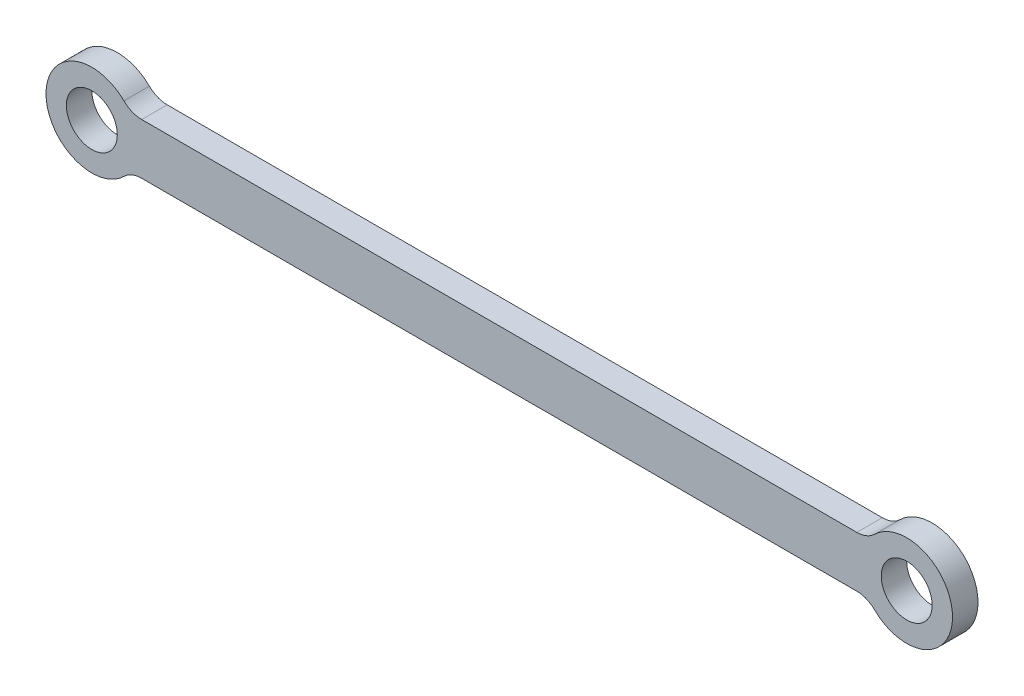
ISO-10303-21;
HEADER;
FILE_DESCRIPTION(('STEP AP214'),'2;1');
FILE_NAME('part.step','',(''),(''),'','','');
FILE_SCHEMA(('AUTOMOTIVE_DESIGN { 1 0 10303 214 1 1 1 1 }'));
ENDSEC;
DATA;
#1=APPLICATION_CONTEXT('core data for automotive mechanical design processes');
#2=APPLICATION_PROTOCOL_DEFINITION('international standard','automotive_design',2000,#1);
#3=PRODUCT_CONTEXT('',#1,'mechanical');
#4=PRODUCT('Part','Part','',(#3));
#5=PRODUCT_RELATED_PRODUCT_CATEGORY('part','',(#4));
#6=PRODUCT_DEFINITION_FORMATION('','',#4);
#7=PRODUCT_DEFINITION_CONTEXT('part definition',#1,'design');
#8=PRODUCT_DEFINITION('design','',#6,#7);
#9=PRODUCT_DEFINITION_SHAPE('','',#8);
#10=(LENGTH_UNIT() NAMED_UNIT(*) SI_UNIT(.MILLI.,.METRE.));
#11=(NAMED_UNIT(*) PLANE_ANGLE_UNIT() SI_UNIT($,.RADIAN.));
#12=(NAMED_UNIT(*) SI_UNIT($,.STERADIAN.) SOLID_ANGLE_UNIT());
#13=UNCERTAINTY_MEASURE_WITH_UNIT(LENGTH_MEASURE(1.E-05),#10,'distance_accuracy_value','');
#14=(GEOMETRIC_REPRESENTATION_CONTEXT(3) GLOBAL_UNCERTAINTY_ASSIGNED_CONTEXT((#13)) GLOBAL_UNIT_ASSIGNED_CONTEXT((#10,
#11,#12)) REPRESENTATION_CONTEXT('',''));
#15=CARTESIAN_POINT('',(0.,0.,0.));
#16=DIRECTION('',(0.,0.,1.));
#17=DIRECTION('',(1.,0.,0.));
#18=AXIS2_PLACEMENT_3D('',#15,#16,#17);
#19=CARTESIAN_POINT('',(150.202041028867,10.,5.));
#20=DIRECTION('',(0.,0.,1.));
#21=DIRECTION('',(1.,0.,0.));
#22=AXIS2_PLACEMENT_3D('',#19,#20,#21);
#23=PLANE('',#22);
#24=CARTESIAN_POINT('',(0.,0.,5.));
#25=DIRECTION('',(0.,0.,1.));
#26=DIRECTION('',(1.,0.,0.));
#27=AXIS2_PLACEMENT_3D('',#24,#25,#26);
#28=CIRCLE('',#27,5.);
#29=CARTESIAN_POINT('',(5.,0.,5.));
#30=VERTEX_POINT('',#29);
#31=EDGE_CURVE('E134',#30,#30,#28,.T.);
#32=ORIENTED_EDGE('',*,*,#31,.F.);
#33=EDGE_LOOP('',(#32));
#34=FACE_BOUND('',#33,.T.);
#35=CARTESIAN_POINT('',(150.202041028867,10.,5.));
#36=DIRECTION('',(0.,0.,-1.));
#37=DIRECTION('',(1.,0.,0.));
#38=AXIS2_PLACEMENT_3D('',#35,#36,#37);
#39=CIRCLE('',#38,4.99999999999999);
#40=CARTESIAN_POINT('',(153.701312089986,6.42857142857143,5.));
#41=VERTEX_POINT('',#40);
#42=CARTESIAN_POINT('',(150.202041028867,5.,5.));
#43=VERTEX_POINT('',#42);
#44=EDGE_CURVE('E145',#41,#43,#39,.T.);
#45=ORIENTED_EDGE('',*,*,#44,.T.);
#46=DIRECTION('',(-1.,0.,0.));
#47=VECTOR('',#46,1.);
#48=CARTESIAN_POINT('',(9.79795897113271,5.,5.));
#49=LINE('',#48,#47);
#50=CARTESIAN_POINT('',(9.79795897113271,5.,5.));
#51=VERTEX_POINT('',#50);
#52=EDGE_CURVE('E93',#43,#51,#49,.T.);
#53=ORIENTED_EDGE('',*,*,#52,.T.);
#54=CARTESIAN_POINT('',(9.79795897113271,10.,5.));
#55=DIRECTION('',(0.,0.,-1.));
#56=DIRECTION('',(-1.,0.,0.));
#57=AXIS2_PLACEMENT_3D('',#54,#55,#56);
#58=CIRCLE('',#57,5.);
#59=CARTESIAN_POINT('',(6.29868791001389,6.42857142857143,5.));
#60=VERTEX_POINT('',#59);
#61=EDGE_CURVE('E160',#51,#60,#58,.T.);
#62=ORIENTED_EDGE('',*,*,#61,.T.);
#63=CARTESIAN_POINT('',(0.,0.,5.));
#64=DIRECTION('',(0.,0.,1.));
#65=DIRECTION('',(1.,0.,0.));
#66=AXIS2_PLACEMENT_3D('',#63,#64,#65);
#67=CIRCLE('',#66,9.);
#68=CARTESIAN_POINT('',(6.29868791001388,-6.42857142857143,5.));
#69=VERTEX_POINT('',#68);
#70=EDGE_CURVE('E173',#60,#69,#67,.T.);
#71=ORIENTED_EDGE('',*,*,#70,.T.);
#72=CARTESIAN_POINT('',(9.79795897113271,-10.,5.));
#73=DIRECTION('',(0.,0.,-1.));
#74=DIRECTION('',(1.,0.,0.));
#75=AXIS2_PLACEMENT_3D('',#72,#73,#74);
#76=CIRCLE('',#75,5.);
#77=CARTESIAN_POINT('',(9.79795897113271,-5.,5.));
#78=VERTEX_POINT('',#77);
#79=EDGE_CURVE('E112',#69,#78,#76,.T.);
#80=ORIENTED_EDGE('',*,*,#79,.T.);
#81=DIRECTION('',(1.,0.,0.));
#82=VECTOR('',#81,1.);
#83=CARTESIAN_POINT('',(9.79795897113271,-5.,5.));
#84=LINE('',#83,#82);
#85=CARTESIAN_POINT('',(150.202041028867,-5.,5.));
#86=VERTEX_POINT('',#85);
#87=EDGE_CURVE('E106',#78,#86,#84,.T.);
#88=ORIENTED_EDGE('',*,*,#87,.T.);
#89=CARTESIAN_POINT('',(150.202041028867,-10.,5.));
#90=DIRECTION('',(0.,0.,-1.));
#91=DIRECTION('',(-1.,0.,0.));
#92=AXIS2_PLACEMENT_3D('',#89,#90,#91);
#93=CIRCLE('',#92,4.99999999999999);
#94=CARTESIAN_POINT('',(153.701312089986,-6.42857142857142,5.));
#95=VERTEX_POINT('',#94);
#96=EDGE_CURVE('E110',#86,#95,#93,.T.);
#97=ORIENTED_EDGE('',*,*,#96,.T.);
#98=CARTESIAN_POINT('',(160.,0.,5.));
#99=DIRECTION('',(0.,0.,1.));
#100=DIRECTION('',(1.,0.,0.));
#101=AXIS2_PLACEMENT_3D('',#98,#99,#100);
#102=CIRCLE('',#101,9.00000000000001);
#103=EDGE_CURVE('E50',#95,#41,#102,.T.);
#104=ORIENTED_EDGE('',*,*,#103,.T.);
#105=EDGE_LOOP('',(#45,#53,#62,#71,#80,#88,#97,#104));
#106=FACE_BOUND('',#105,.T.);
#107=CARTESIAN_POINT('',(160.,0.,5.));
#108=DIRECTION('',(0.,0.,1.));
#109=DIRECTION('',(1.,0.,0.));
#110=AXIS2_PLACEMENT_3D('',#107,#108,#109);
#111=CIRCLE('',#110,4.99999999999999);
#112=CARTESIAN_POINT('',(165.,0.,5.));
#113=VERTEX_POINT('',#112);
#114=EDGE_CURVE('E182',#113,#113,#111,.T.);
#115=ORIENTED_EDGE('',*,*,#114,.F.);
#116=EDGE_LOOP('',(#115));
#117=FACE_BOUND('',#116,.T.);
#118=ADVANCED_FACE('F33',(#34,#106,#117),#23,.T.);
#119=CARTESIAN_POINT('',(150.202041028867,10.,0.));
#120=DIRECTION('',(0.,0.,1.));
#121=DIRECTION('',(1.,0.,0.));
#122=AXIS2_PLACEMENT_3D('',#119,#120,#121);
#123=PLANE('',#122);
#124=CARTESIAN_POINT('',(150.202041028867,10.,0.));
#125=DIRECTION('',(0.,0.,-1.));
#126=DIRECTION('',(1.,0.,0.));
#127=AXIS2_PLACEMENT_3D('',#124,#125,#126);
#128=CIRCLE('',#127,4.99999999999999);
#129=CARTESIAN_POINT('',(153.701312089986,6.42857142857143,0.));
#130=VERTEX_POINT('',#129);
#131=CARTESIAN_POINT('',(150.202041028867,5.,0.));
#132=VERTEX_POINT('',#131);
#133=EDGE_CURVE('E130',#130,#132,#128,.T.);
#134=ORIENTED_EDGE('',*,*,#133,.F.);
#135=CARTESIAN_POINT('',(160.,0.,0.));
#136=DIRECTION('',(0.,0.,1.));
#137=DIRECTION('',(1.,0.,0.));
#138=AXIS2_PLACEMENT_3D('',#135,#136,#137);
#139=CIRCLE('',#138,9.00000000000001);
#140=CARTESIAN_POINT('',(153.701312089986,-6.42857142857142,0.));
#141=VERTEX_POINT('',#140);
#142=EDGE_CURVE('E85',#141,#130,#139,.T.);
#143=ORIENTED_EDGE('',*,*,#142,.F.);
#144=CARTESIAN_POINT('',(150.202041028867,-10.,0.));
#145=DIRECTION('',(0.,0.,-1.));
#146=DIRECTION('',(-1.,0.,0.));
#147=AXIS2_PLACEMENT_3D('',#144,#145,#146);
#148=CIRCLE('',#147,4.99999999999999);
#149=CARTESIAN_POINT('',(150.202041028867,-5.,0.));
#150=VERTEX_POINT('',#149);
#151=EDGE_CURVE('E79',#150,#141,#148,.T.);
#152=ORIENTED_EDGE('',*,*,#151,.F.);
#153=DIRECTION('',(1.,0.,0.));
#154=VECTOR('',#153,1.);
#155=CARTESIAN_POINT('',(9.79795897113271,-5.,0.));
#156=LINE('',#155,#154);
#157=CARTESIAN_POINT('',(9.79795897113271,-5.,0.));
#158=VERTEX_POINT('',#157);
#159=EDGE_CURVE('E120',#158,#150,#156,.T.);
#160=ORIENTED_EDGE('',*,*,#159,.F.);
#161=CARTESIAN_POINT('',(9.79795897113271,-10.,0.));
#162=DIRECTION('',(0.,0.,-1.));
#163=DIRECTION('',(1.,0.,0.));
#164=AXIS2_PLACEMENT_3D('',#161,#162,#163);
#165=CIRCLE('',#164,5.);
#166=CARTESIAN_POINT('',(6.29868791001388,-6.42857142857143,0.));
#167=VERTEX_POINT('',#166);
#168=EDGE_CURVE('E140',#167,#158,#165,.T.);
#169=ORIENTED_EDGE('',*,*,#168,.F.);
#170=CARTESIAN_POINT('',(0.,0.,0.));
#171=DIRECTION('',(0.,0.,1.));
#172=DIRECTION('',(1.,0.,0.));
#173=AXIS2_PLACEMENT_3D('',#170,#171,#172);
#174=CIRCLE('',#173,9.);
#175=CARTESIAN_POINT('',(6.29868791001389,6.42857142857143,0.));
#176=VERTEX_POINT('',#175);
#177=EDGE_CURVE('E138',#176,#167,#174,.T.);
#178=ORIENTED_EDGE('',*,*,#177,.F.);
#179=CARTESIAN_POINT('',(9.79795897113271,10.,0.));
#180=DIRECTION('',(0.,0.,-1.));
#181=DIRECTION('',(-1.,0.,0.));
#182=AXIS2_PLACEMENT_3D('',#179,#180,#181);
#183=CIRCLE('',#182,5.);
#184=CARTESIAN_POINT('',(9.79795897113271,5.,0.));
#185=VERTEX_POINT('',#184);
#186=EDGE_CURVE('E136',#185,#176,#183,.T.);
#187=ORIENTED_EDGE('',*,*,#186,.F.);
#188=DIRECTION('',(-1.,0.,0.));
#189=VECTOR('',#188,1.);
#190=CARTESIAN_POINT('',(9.79795897113271,5.,0.));
#191=LINE('',#190,#189);
#192=EDGE_CURVE('E133',#132,#185,#191,.T.);
#193=ORIENTED_EDGE('',*,*,#192,.F.);
#194=EDGE_LOOP('',(#134,#143,#152,#160,#169,#178,#187,#193));
#195=FACE_BOUND('',#194,.T.);
#196=CARTESIAN_POINT('',(0.,0.,0.));
#197=DIRECTION('',(0.,0.,1.));
#198=DIRECTION('',(1.,0.,0.));
#199=AXIS2_PLACEMENT_3D('',#196,#197,#198);
#200=CIRCLE('',#199,5.);
#201=CARTESIAN_POINT('',(5.,0.,0.));
#202=VERTEX_POINT('',#201);
#203=EDGE_CURVE('E179',#202,#202,#200,.T.);
#204=ORIENTED_EDGE('',*,*,#203,.T.);
#205=EDGE_LOOP('',(#204));
#206=FACE_BOUND('',#205,.T.);
#207=CARTESIAN_POINT('',(160.,0.,0.));
#208=DIRECTION('',(0.,0.,1.));
#209=DIRECTION('',(1.,0.,0.));
#210=AXIS2_PLACEMENT_3D('',#207,#208,#209);
#211=CIRCLE('',#210,4.99999999999999);
#212=CARTESIAN_POINT('',(165.,0.,0.));
#213=VERTEX_POINT('',#212);
#214=EDGE_CURVE('E185',#213,#213,#211,.T.);
#215=ORIENTED_EDGE('',*,*,#214,.T.);
#216=EDGE_LOOP('',(#215));
#217=FACE_BOUND('',#216,.T.);
#218=ADVANCED_FACE('F164',(#195,#206,#217),#123,.F.);
#219=CARTESIAN_POINT('',(150.202041028867,10.,5.));
#220=DIRECTION('',(0.,0.,-1.));
#221=DIRECTION('',(-1.,0.,0.));
#222=AXIS2_PLACEMENT_3D('',#219,#220,#221);
#223=CYLINDRICAL_SURFACE('',#222,4.99999999999999);
#224=ORIENTED_EDGE('',*,*,#133,.T.);
#225=DIRECTION('',(0.,0.,-1.));
#226=VECTOR('',#225,1.);
#227=CARTESIAN_POINT('',(150.202041028867,5.,5.));
#228=LINE('',#227,#226);
#229=EDGE_CURVE('E11',#43,#132,#228,.T.);
#230=ORIENTED_EDGE('',*,*,#229,.F.);
#231=ORIENTED_EDGE('',*,*,#44,.F.);
#232=DIRECTION('',(0.,0.,-1.));
#233=VECTOR('',#232,1.);
#234=CARTESIAN_POINT('',(153.701312089986,6.42857142857143,5.));
#235=LINE('',#234,#233);
#236=EDGE_CURVE('E126',#41,#130,#235,.T.);
#237=ORIENTED_EDGE('',*,*,#236,.T.);
#238=EDGE_LOOP('',(#224,#230,#231,#237));
#239=FACE_BOUND('',#238,.T.);
#240=ADVANCED_FACE('F35',(#239),#223,.F.);
#241=CARTESIAN_POINT('',(9.79795897113271,5.,5.));
#242=DIRECTION('',(0.,-1.,0.));
#243=DIRECTION('',(0.,0.,-1.));
#244=AXIS2_PLACEMENT_3D('',#241,#242,#243);
#245=PLANE('',#244);
#246=ORIENTED_EDGE('',*,*,#192,.T.);
#247=DIRECTION('',(0.,0.,-1.));
#248=VECTOR('',#247,1.);
#249=CARTESIAN_POINT('',(9.79795897113271,5.,5.));
#250=LINE('',#249,#248);
#251=EDGE_CURVE('E42',#51,#185,#250,.T.);
#252=ORIENTED_EDGE('',*,*,#251,.F.);
#253=ORIENTED_EDGE('',*,*,#52,.F.);
#254=ORIENTED_EDGE('',*,*,#229,.T.);
#255=EDGE_LOOP('',(#246,#252,#253,#254));
#256=FACE_BOUND('',#255,.T.);
#257=ADVANCED_FACE('F217',(#256),#245,.F.);
#258=CARTESIAN_POINT('',(9.79795897113271,10.,5.));
#259=DIRECTION('',(0.,0.,-1.));
#260=DIRECTION('',(-1.,0.,0.));
#261=AXIS2_PLACEMENT_3D('',#258,#259,#260);
#262=CYLINDRICAL_SURFACE('',#261,5.);
#263=ORIENTED_EDGE('',*,*,#186,.T.);
#264=DIRECTION('',(0.,0.,-1.));
#265=VECTOR('',#264,1.);
#266=CARTESIAN_POINT('',(6.29868791001389,6.42857142857143,5.));
#267=LINE('',#266,#265);
#268=EDGE_CURVE('E152',#60,#176,#267,.T.);
#269=ORIENTED_EDGE('',*,*,#268,.F.);
#270=ORIENTED_EDGE('',*,*,#61,.F.);
#271=ORIENTED_EDGE('',*,*,#251,.T.);
#272=EDGE_LOOP('',(#263,#269,#270,#271));
#273=FACE_BOUND('',#272,.T.);
#274=ADVANCED_FACE('F158',(#273),#262,.F.);
#275=CARTESIAN_POINT('',(0.,0.,5.));
#276=DIRECTION('',(0.,0.,-1.));
#277=DIRECTION('',(-1.,0.,0.));
#278=AXIS2_PLACEMENT_3D('',#275,#276,#277);
#279=CYLINDRICAL_SURFACE('',#278,9.);
#280=ORIENTED_EDGE('',*,*,#177,.T.);
#281=DIRECTION('',(0.,0.,-1.));
#282=VECTOR('',#281,1.);
#283=CARTESIAN_POINT('',(6.29868791001388,-6.42857142857143,5.));
#284=LINE('',#283,#282);
#285=EDGE_CURVE('E149',#69,#167,#284,.T.);
#286=ORIENTED_EDGE('',*,*,#285,.F.);
#287=ORIENTED_EDGE('',*,*,#70,.F.);
#288=ORIENTED_EDGE('',*,*,#268,.T.);
#289=EDGE_LOOP('',(#280,#286,#287,#288));
#290=FACE_BOUND('',#289,.T.);
#291=ADVANCED_FACE('F169',(#290),#279,.T.);
#292=CARTESIAN_POINT('',(9.79795897113271,-10.,5.));
#293=DIRECTION('',(0.,0.,-1.));
#294=DIRECTION('',(-1.,0.,0.));
#295=AXIS2_PLACEMENT_3D('',#292,#293,#294);
#296=CYLINDRICAL_SURFACE('',#295,5.);
#297=ORIENTED_EDGE('',*,*,#168,.T.);
#298=DIRECTION('',(0.,0.,-1.));
#299=VECTOR('',#298,1.);
#300=CARTESIAN_POINT('',(9.79795897113271,-5.,5.));
#301=LINE('',#300,#299);
#302=EDGE_CURVE('E121',#78,#158,#301,.T.);
#303=ORIENTED_EDGE('',*,*,#302,.F.);
#304=ORIENTED_EDGE('',*,*,#79,.F.);
#305=ORIENTED_EDGE('',*,*,#285,.T.);
#306=EDGE_LOOP('',(#297,#303,#304,#305));
#307=FACE_BOUND('',#306,.T.);
#308=ADVANCED_FACE('F172',(#307),#296,.F.);
#309=CARTESIAN_POINT('',(9.79795897113271,-5.,5.));
#310=DIRECTION('',(0.,1.,0.));
#311=DIRECTION('',(0.,0.,1.));
#312=AXIS2_PLACEMENT_3D('',#309,#310,#311);
#313=PLANE('',#312);
#314=ORIENTED_EDGE('',*,*,#159,.T.);
#315=DIRECTION('',(0.,0.,-1.));
#316=VECTOR('',#315,1.);
#317=CARTESIAN_POINT('',(150.202041028867,-5.,5.));
#318=LINE('',#317,#316);
#319=EDGE_CURVE('E117',#86,#150,#318,.T.);
#320=ORIENTED_EDGE('',*,*,#319,.F.);
#321=ORIENTED_EDGE('',*,*,#87,.F.);
#322=ORIENTED_EDGE('',*,*,#302,.T.);
#323=EDGE_LOOP('',(#314,#320,#321,#322));
#324=FACE_BOUND('',#323,.T.);
#325=ADVANCED_FACE('F118',(#324),#313,.F.);
#326=CARTESIAN_POINT('',(150.202041028867,-10.,5.));
#327=DIRECTION('',(0.,0.,-1.));
#328=DIRECTION('',(-1.,0.,0.));
#329=AXIS2_PLACEMENT_3D('',#326,#327,#328);
#330=CYLINDRICAL_SURFACE('',#329,4.99999999999999);
#331=ORIENTED_EDGE('',*,*,#151,.T.);
#332=DIRECTION('',(0.,0.,-1.));
#333=VECTOR('',#332,1.);
#334=CARTESIAN_POINT('',(153.701312089986,-6.42857142857142,5.));
#335=LINE('',#334,#333);
#336=EDGE_CURVE('E122',#95,#141,#335,.T.);
#337=ORIENTED_EDGE('',*,*,#336,.F.);
#338=ORIENTED_EDGE('',*,*,#96,.F.);
#339=ORIENTED_EDGE('',*,*,#319,.T.);
#340=EDGE_LOOP('',(#331,#337,#338,#339));
#341=FACE_BOUND('',#340,.T.);
#342=ADVANCED_FACE('F124',(#341),#330,.F.);
#343=CARTESIAN_POINT('',(160.,0.,5.));
#344=DIRECTION('',(0.,0.,-1.));
#345=DIRECTION('',(-1.,0.,0.));
#346=AXIS2_PLACEMENT_3D('',#343,#344,#345);
#347=CYLINDRICAL_SURFACE('',#346,9.00000000000001);
#348=ORIENTED_EDGE('',*,*,#142,.T.);
#349=ORIENTED_EDGE('',*,*,#236,.F.);
#350=ORIENTED_EDGE('',*,*,#103,.F.);
#351=ORIENTED_EDGE('',*,*,#336,.T.);
#352=EDGE_LOOP('',(#348,#349,#350,#351));
#353=FACE_BOUND('',#352,.T.);
#354=ADVANCED_FACE('F205',(#353),#347,.T.);
#355=CARTESIAN_POINT('',(0.,0.,5.));
#356=DIRECTION('',(0.,0.,-1.));
#357=DIRECTION('',(-1.,0.,0.));
#358=AXIS2_PLACEMENT_3D('',#355,#356,#357);
#359=CYLINDRICAL_SURFACE('',#358,5.);
#360=ORIENTED_EDGE('',*,*,#31,.T.);
#361=EDGE_LOOP('',(#360));
#362=FACE_BOUND('',#361,.T.);
#363=ORIENTED_EDGE('',*,*,#203,.F.);
#364=EDGE_LOOP('',(#363));
#365=FACE_BOUND('',#364,.T.);
#366=ADVANCED_FACE('F202',(#362,#365),#359,.F.);
#367=CARTESIAN_POINT('',(160.,0.,5.));
#368=DIRECTION('',(0.,0.,-1.));
#369=DIRECTION('',(-1.,0.,0.));
#370=AXIS2_PLACEMENT_3D('',#367,#368,#369);
#371=CYLINDRICAL_SURFACE('',#370,4.99999999999999);
#372=ORIENTED_EDGE('',*,*,#114,.T.);
#373=EDGE_LOOP('',(#372));
#374=FACE_BOUND('',#373,.T.);
#375=ORIENTED_EDGE('',*,*,#214,.F.);
#376=EDGE_LOOP('',(#375));
#377=FACE_BOUND('',#376,.T.);
#378=ADVANCED_FACE('F191',(#374,#377),#371,.F.);
#379=CLOSED_SHELL('',(#118,#218,#240,#257,#274,#291,#308,#325,#342,#354,#366,#378));
#380=MANIFOLD_SOLID_BREP('B2',#379);
#381=ADVANCED_BREP_SHAPE_REPRESENTATION('',(#18,#380),#14);
#382=SHAPE_DEFINITION_REPRESENTATION(#9,#381);
ENDSEC;
END-ISO-10303-21;
